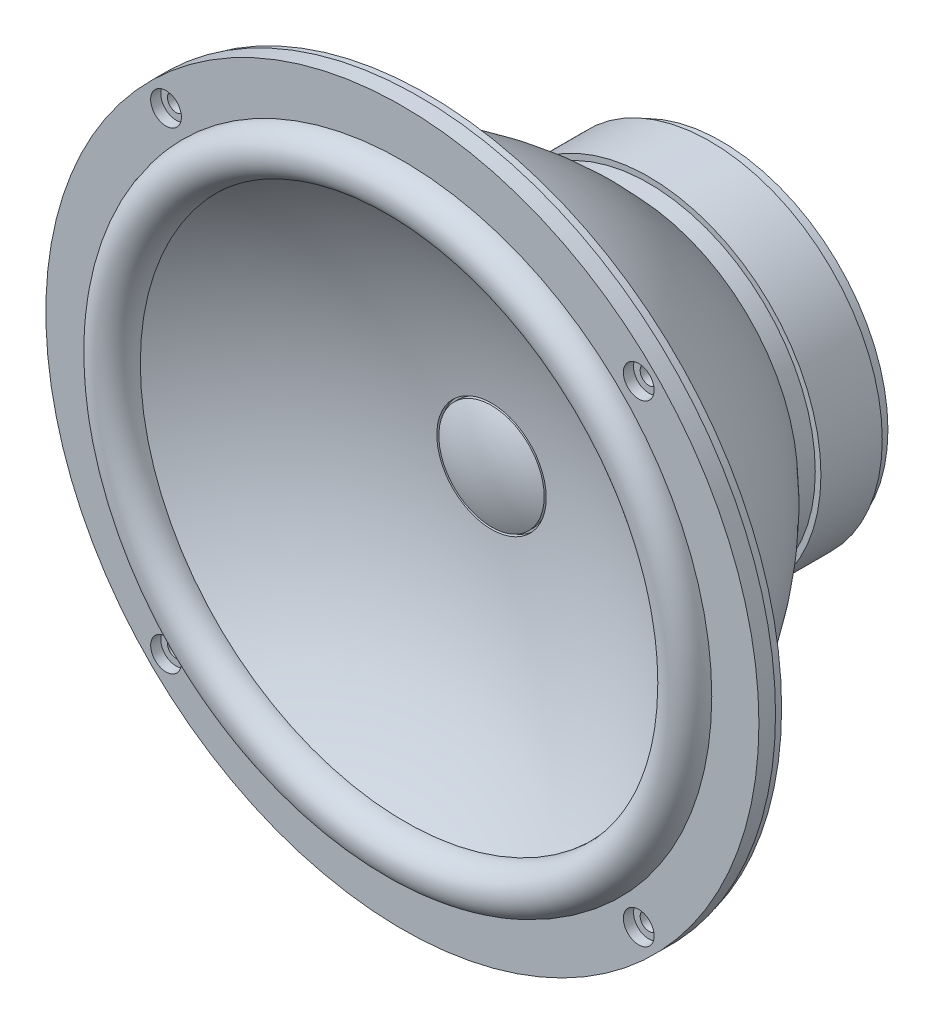
ISO-10303-21;
HEADER;
FILE_DESCRIPTION(('STEP AP214'),'2;1');
FILE_NAME('part.step','',(''),(''),'','','');
FILE_SCHEMA(('AUTOMOTIVE_DESIGN { 1 0 10303 214 1 1 1 1 }'));
ENDSEC;
DATA;
#1=APPLICATION_CONTEXT('core data for automotive mechanical design processes');
#2=APPLICATION_PROTOCOL_DEFINITION('international standard','automotive_design',2000,#1);
#3=PRODUCT_CONTEXT('',#1,'mechanical');
#4=PRODUCT('Part','Part','',(#3));
#5=PRODUCT_RELATED_PRODUCT_CATEGORY('part','',(#4));
#6=PRODUCT_DEFINITION_FORMATION('','',#4);
#7=PRODUCT_DEFINITION_CONTEXT('part definition',#1,'design');
#8=PRODUCT_DEFINITION('design','',#6,#7);
#9=PRODUCT_DEFINITION_SHAPE('','',#8);
#10=(LENGTH_UNIT() NAMED_UNIT(*) SI_UNIT(.MILLI.,.METRE.));
#11=(NAMED_UNIT(*) PLANE_ANGLE_UNIT() SI_UNIT($,.RADIAN.));
#12=(NAMED_UNIT(*) SI_UNIT($,.STERADIAN.) SOLID_ANGLE_UNIT());
#13=UNCERTAINTY_MEASURE_WITH_UNIT(LENGTH_MEASURE(1.E-05),#10,'distance_accuracy_value','');
#14=(GEOMETRIC_REPRESENTATION_CONTEXT(3) GLOBAL_UNCERTAINTY_ASSIGNED_CONTEXT((#13)) GLOBAL_UNIT_ASSIGNED_CONTEXT((#10,
#11,#12)) REPRESENTATION_CONTEXT('',''));
#15=CARTESIAN_POINT('',(0.,0.,0.));
#16=DIRECTION('',(0.,0.,1.));
#17=DIRECTION('',(1.,0.,0.));
#18=AXIS2_PLACEMENT_3D('',#15,#16,#17);
#19=CARTESIAN_POINT('',(-58.3363094478903,58.3363094478901,-85.8));
#20=DIRECTION('',(0.,0.,1.));
#21=DIRECTION('',(1.,0.,0.));
#22=AXIS2_PLACEMENT_3D('',#19,#20,#21);
#23=CYLINDRICAL_SURFACE('',#22,2.15);
#24=CARTESIAN_POINT('',(-58.3363094478903,58.3363094478901,-6.09999999999999));
#25=DIRECTION('',(0.,0.,-1.));
#26=DIRECTION('',(-1.,0.,0.));
#27=AXIS2_PLACEMENT_3D('',#24,#25,#26);
#28=CIRCLE('',#27,2.15);
#29=CARTESIAN_POINT('',(-60.4863094478903,58.3363094478901,-6.09999999999999));
#30=VERTEX_POINT('',#29);
#31=EDGE_CURVE('E71',#30,#30,#28,.T.);
#32=ORIENTED_EDGE('',*,*,#31,.T.);
#33=EDGE_LOOP('',(#32));
#34=FACE_BOUND('',#33,.T.);
#35=CARTESIAN_POINT('',(-58.3363094478903,58.3363094478901,-2.5019));
#36=DIRECTION('',(0.,0.,1.));
#37=DIRECTION('',(1.,0.,0.));
#38=AXIS2_PLACEMENT_3D('',#35,#36,#37);
#39=CIRCLE('',#38,2.15);
#40=CARTESIAN_POINT('',(-56.1863094478903,58.3363094478901,-2.5019));
#41=VERTEX_POINT('',#40);
#42=EDGE_CURVE('E47',#41,#41,#39,.F.);
#43=ORIENTED_EDGE('',*,*,#42,.F.);
#44=EDGE_LOOP('',(#43));
#45=FACE_BOUND('',#44,.T.);
#46=ADVANCED_FACE('F43',(#34,#45),#23,.F.);
#47=CARTESIAN_POINT('',(58.3363094478901,58.3363094478903,-85.8));
#48=DIRECTION('',(0.,0.,1.));
#49=DIRECTION('',(1.,0.,0.));
#50=AXIS2_PLACEMENT_3D('',#47,#48,#49);
#51=CYLINDRICAL_SURFACE('',#50,2.15);
#52=CARTESIAN_POINT('',(58.3363094478901,58.3363094478903,-6.10000000000001));
#53=DIRECTION('',(0.,0.,-1.));
#54=DIRECTION('',(-1.,0.,0.));
#55=AXIS2_PLACEMENT_3D('',#52,#53,#54);
#56=CIRCLE('',#55,2.15);
#57=CARTESIAN_POINT('',(56.1863094478901,58.3363094478903,-6.10000000000001));
#58=VERTEX_POINT('',#57);
#59=EDGE_CURVE('E75',#58,#58,#56,.T.);
#60=ORIENTED_EDGE('',*,*,#59,.T.);
#61=EDGE_LOOP('',(#60));
#62=FACE_BOUND('',#61,.T.);
#63=CARTESIAN_POINT('',(58.3363094478901,58.3363094478903,-2.5019));
#64=DIRECTION('',(0.,0.,1.));
#65=DIRECTION('',(1.,0.,0.));
#66=AXIS2_PLACEMENT_3D('',#63,#64,#65);
#67=CIRCLE('',#66,2.15);
#68=CARTESIAN_POINT('',(60.4863094478901,58.3363094478903,-2.5019));
#69=VERTEX_POINT('',#68);
#70=EDGE_CURVE('E66',#69,#69,#67,.F.);
#71=ORIENTED_EDGE('',*,*,#70,.F.);
#72=EDGE_LOOP('',(#71));
#73=FACE_BOUND('',#72,.T.);
#74=ADVANCED_FACE('F165',(#62,#73),#51,.F.);
#75=CARTESIAN_POINT('',(58.3363094478903,-58.3363094478901,-85.8));
#76=DIRECTION('',(0.,0.,1.));
#77=DIRECTION('',(1.,0.,0.));
#78=AXIS2_PLACEMENT_3D('',#75,#76,#77);
#79=CYLINDRICAL_SURFACE('',#78,2.15);
#80=CARTESIAN_POINT('',(58.3363094478903,-58.3363094478901,-6.10000000000001));
#81=DIRECTION('',(0.,0.,-1.));
#82=DIRECTION('',(-1.,0.,0.));
#83=AXIS2_PLACEMENT_3D('',#80,#81,#82);
#84=CIRCLE('',#83,2.15);
#85=CARTESIAN_POINT('',(56.1863094478903,-58.3363094478901,-6.10000000000001));
#86=VERTEX_POINT('',#85);
#87=EDGE_CURVE('E80',#86,#86,#84,.T.);
#88=ORIENTED_EDGE('',*,*,#87,.T.);
#89=EDGE_LOOP('',(#88));
#90=FACE_BOUND('',#89,.T.);
#91=CARTESIAN_POINT('',(58.3363094478903,-58.3363094478901,-2.5019));
#92=DIRECTION('',(0.,0.,1.));
#93=DIRECTION('',(1.,0.,0.));
#94=AXIS2_PLACEMENT_3D('',#91,#92,#93);
#95=CIRCLE('',#94,2.15);
#96=CARTESIAN_POINT('',(60.4863094478903,-58.3363094478901,-2.5019));
#97=VERTEX_POINT('',#96);
#98=EDGE_CURVE('E63',#97,#97,#95,.F.);
#99=ORIENTED_EDGE('',*,*,#98,.F.);
#100=EDGE_LOOP('',(#99));
#101=FACE_BOUND('',#100,.T.);
#102=ADVANCED_FACE('F171',(#90,#101),#79,.F.);
#103=CARTESIAN_POINT('',(-58.3363094478901,-58.3363094478903,-85.8));
#104=DIRECTION('',(0.,0.,1.));
#105=DIRECTION('',(1.,0.,0.));
#106=AXIS2_PLACEMENT_3D('',#103,#104,#105);
#107=CYLINDRICAL_SURFACE('',#106,2.15);
#108=CARTESIAN_POINT('',(-58.3363094478901,-58.3363094478903,-6.09999999999999));
#109=DIRECTION('',(0.,0.,-1.));
#110=DIRECTION('',(-1.,0.,0.));
#111=AXIS2_PLACEMENT_3D('',#108,#109,#110);
#112=CIRCLE('',#111,2.15);
#113=CARTESIAN_POINT('',(-60.4863094478901,-58.3363094478903,-6.09999999999999));
#114=VERTEX_POINT('',#113);
#115=EDGE_CURVE('E88',#114,#114,#112,.T.);
#116=ORIENTED_EDGE('',*,*,#115,.T.);
#117=EDGE_LOOP('',(#116));
#118=FACE_BOUND('',#117,.T.);
#119=CARTESIAN_POINT('',(-58.3363094478901,-58.3363094478903,-2.5019));
#120=DIRECTION('',(0.,0.,1.));
#121=DIRECTION('',(1.,0.,0.));
#122=AXIS2_PLACEMENT_3D('',#119,#120,#121);
#123=CIRCLE('',#122,2.15);
#124=CARTESIAN_POINT('',(-56.1863094478901,-58.3363094478903,-2.5019));
#125=VERTEX_POINT('',#124);
#126=EDGE_CURVE('E60',#125,#125,#123,.F.);
#127=ORIENTED_EDGE('',*,*,#126,.F.);
#128=EDGE_LOOP('',(#127));
#129=FACE_BOUND('',#128,.T.);
#130=ADVANCED_FACE('F177',(#118,#129),#107,.F.);
#131=CARTESIAN_POINT('',(0.,0.,-0.0269573961349388));
#132=DIRECTION('',(0.,0.,1.));
#133=DIRECTION('',(1.,0.,0.));
#134=AXIS2_PLACEMENT_3D('',#131,#132,#133);
#135=TOROIDAL_SURFACE('',#134,70.8331593014409,5.52695739613496);
#136=CARTESIAN_POINT('',(0.,0.,0.));
#137=DIRECTION('',(0.,0.,1.));
#138=DIRECTION('',(1.,0.,0.));
#139=AXIS2_PLACEMENT_3D('',#136,#137,#138);
#140=CIRCLE('',#139,76.3600509556607);
#141=CARTESIAN_POINT('',(76.3600509556607,0.,0.));
#142=VERTEX_POINT('',#141);
#143=EDGE_CURVE('E91',#142,#142,#140,.T.);
#144=ORIENTED_EDGE('',*,*,#143,.T.);
#145=EDGE_LOOP('',(#144));
#146=FACE_BOUND('',#145,.T.);
#147=CARTESIAN_POINT('',(0.,0.,-0.661359358512217));
#148=DIRECTION('',(0.,0.,1.));
#149=DIRECTION('',(1.,0.,0.));
#150=AXIS2_PLACEMENT_3D('',#147,#148,#149);
#151=CIRCLE('',#150,65.3427319766488);
#152=CARTESIAN_POINT('',(65.3427319766488,0.,-0.66135935851222));
#153=VERTEX_POINT('',#152);
#154=EDGE_CURVE('E10',#153,#153,#151,.T.);
#155=ORIENTED_EDGE('',*,*,#154,.F.);
#156=EDGE_LOOP('',(#155));
#157=FACE_BOUND('',#156,.T.);
#158=ADVANCED_FACE('F45',(#146,#157),#135,.T.);
#159=CARTESIAN_POINT('',(0.,0.,77.4350242939571));
#160=DIRECTION('',(0.,0.,1.));
#161=DIRECTION('',(1.,0.,0.));
#162=AXIS2_PLACEMENT_3D('',#159,#160,#161);
#163=DEGENERATE_TOROIDAL_SURFACE('',#162,2.88510745885022,100.,.T.);
#164=ORIENTED_EDGE('',*,*,#154,.T.);
#165=EDGE_LOOP('',(#164));
#166=FACE_BOUND('',#165,.T.);
#167=CARTESIAN_POINT('',(0.,0.,-22.));
#168=DIRECTION('',(0.,0.,1.));
#169=DIRECTION('',(1.,0.,0.));
#170=AXIS2_PLACEMENT_3D('',#167,#168,#169);
#171=CIRCLE('',#170,13.5);
#172=CARTESIAN_POINT('',(13.5,0.,-22.));
#173=VERTEX_POINT('',#172);
#174=EDGE_CURVE('E51',#173,#173,#171,.T.);
#175=ORIENTED_EDGE('',*,*,#174,.F.);
#176=EDGE_LOOP('',(#175));
#177=FACE_BOUND('',#176,.T.);
#178=ADVANCED_FACE('F155',(#166,#177),#163,.F.);
#179=CARTESIAN_POINT('',(0.,0.,-19.2403830344269));
#180=DIRECTION('',(0.,0.,1.));
#181=DIRECTION('',(1.,0.,0.));
#182=AXIS2_PLACEMENT_3D('',#179,#180,#181);
#183=CYLINDRICAL_SURFACE('',#182,13.5);
#184=ORIENTED_EDGE('',*,*,#174,.T.);
#185=EDGE_LOOP('',(#184));
#186=FACE_BOUND('',#185,.T.);
#187=CARTESIAN_POINT('',(0.,0.,-23.));
#188=DIRECTION('',(0.,0.,1.));
#189=DIRECTION('',(1.,0.,0.));
#190=AXIS2_PLACEMENT_3D('',#187,#188,#189);
#191=CIRCLE('',#190,13.5);
#192=CARTESIAN_POINT('',(13.5,0.,-23.));
#193=VERTEX_POINT('',#192);
#194=EDGE_CURVE('E56',#193,#193,#191,.T.);
#195=ORIENTED_EDGE('',*,*,#194,.F.);
#196=EDGE_LOOP('',(#195));
#197=FACE_BOUND('',#196,.T.);
#198=ADVANCED_FACE('F153',(#186,#197),#183,.F.);
#199=CARTESIAN_POINT('',(13.5,0.,-23.));
#200=DIRECTION('',(0.,0.,1.));
#201=DIRECTION('',(1.,0.,0.));
#202=AXIS2_PLACEMENT_3D('',#199,#200,#201);
#203=PLANE('',#202);
#204=ORIENTED_EDGE('',*,*,#194,.T.);
#205=EDGE_LOOP('',(#204));
#206=FACE_BOUND('',#205,.T.);
#207=CARTESIAN_POINT('',(0.,0.,-23.));
#208=DIRECTION('',(0.,0.,1.));
#209=DIRECTION('',(1.,0.,0.));
#210=AXIS2_PLACEMENT_3D('',#207,#208,#209);
#211=CIRCLE('',#210,13.);
#212=CARTESIAN_POINT('',(13.,0.,-23.));
#213=VERTEX_POINT('',#212);
#214=EDGE_CURVE('E145',#213,#213,#211,.T.);
#215=ORIENTED_EDGE('',*,*,#214,.F.);
#216=EDGE_LOOP('',(#215));
#217=FACE_BOUND('',#216,.T.);
#218=ADVANCED_FACE('F150',(#206,#217),#203,.T.);
#219=CARTESIAN_POINT('',(0.,0.,-19.2403830344269));
#220=DIRECTION('',(0.,0.,1.));
#221=DIRECTION('',(1.,0.,0.));
#222=AXIS2_PLACEMENT_3D('',#219,#220,#221);
#223=CYLINDRICAL_SURFACE('',#222,13.);
#224=ORIENTED_EDGE('',*,*,#214,.T.);
#225=EDGE_LOOP('',(#224));
#226=FACE_BOUND('',#225,.T.);
#227=CARTESIAN_POINT('',(0.,0.,-22.));
#228=DIRECTION('',(0.,0.,1.));
#229=DIRECTION('',(1.,0.,0.));
#230=AXIS2_PLACEMENT_3D('',#227,#228,#229);
#231=CIRCLE('',#230,13.);
#232=CARTESIAN_POINT('',(13.,0.,-22.));
#233=VERTEX_POINT('',#232);
#234=EDGE_CURVE('E142',#233,#233,#231,.T.);
#235=ORIENTED_EDGE('',*,*,#234,.F.);
#236=EDGE_LOOP('',(#235));
#237=FACE_BOUND('',#236,.T.);
#238=ADVANCED_FACE('F162',(#226,#237),#223,.T.);
#239=CARTESIAN_POINT('',(0.,0.,-51.2403830344269));
#240=DIRECTION('',(0.,0.,1.));
#241=DIRECTION('',(1.,0.,0.));
#242=AXIS2_PLACEMENT_3D('',#239,#240,#241);
#243=SPHERICAL_SURFACE('',#242,32.);
#244=ORIENTED_EDGE('',*,*,#234,.T.);
#245=EDGE_LOOP('',(#244));
#246=FACE_BOUND('',#245,.T.);
#247=ADVANCED_FACE('F246',(#246),#243,.T.);
#248=CARTESIAN_POINT('',(2.,0.,-85.8));
#249=DIRECTION('',(0.,0.,-1.));
#250=DIRECTION('',(-1.,0.,0.));
#251=AXIS2_PLACEMENT_3D('',#248,#249,#250);
#252=PLANE('',#251);
#253=CARTESIAN_POINT('',(0.,0.,-85.8));
#254=DIRECTION('',(0.,0.,1.));
#255=DIRECTION('',(1.,0.,0.));
#256=AXIS2_PLACEMENT_3D('',#253,#254,#255);
#257=CIRCLE('',#256,2.);
#258=CARTESIAN_POINT('',(2.,0.,-85.8));
#259=VERTEX_POINT('',#258);
#260=EDGE_CURVE('E139',#259,#259,#257,.T.);
#261=ORIENTED_EDGE('',*,*,#260,.F.);
#262=EDGE_LOOP('',(#261));
#263=FACE_BOUND('',#262,.T.);
#264=ADVANCED_FACE('F242',(#263),#252,.T.);
#265=CARTESIAN_POINT('',(0.,0.,-19.2403830344269));
#266=DIRECTION('',(0.,0.,1.));
#267=DIRECTION('',(1.,0.,0.));
#268=AXIS2_PLACEMENT_3D('',#265,#266,#267);
#269=CYLINDRICAL_SURFACE('',#268,2.);
#270=ORIENTED_EDGE('',*,*,#260,.T.);
#271=EDGE_LOOP('',(#270));
#272=FACE_BOUND('',#271,.T.);
#273=CARTESIAN_POINT('',(0.,0.,-83.8));
#274=DIRECTION('',(0.,0.,1.));
#275=DIRECTION('',(1.,0.,0.));
#276=AXIS2_PLACEMENT_3D('',#273,#274,#275);
#277=CIRCLE('',#276,2.);
#278=CARTESIAN_POINT('',(2.,0.,-83.8));
#279=VERTEX_POINT('',#278);
#280=EDGE_CURVE('E136',#279,#279,#277,.T.);
#281=ORIENTED_EDGE('',*,*,#280,.F.);
#282=EDGE_LOOP('',(#281));
#283=FACE_BOUND('',#282,.T.);
#284=ADVANCED_FACE('F238',(#272,#283),#269,.T.);
#285=CARTESIAN_POINT('',(5.,0.,-83.8));
#286=DIRECTION('',(0.,0.,-1.));
#287=DIRECTION('',(-1.,0.,0.));
#288=AXIS2_PLACEMENT_3D('',#285,#286,#287);
#289=PLANE('',#288);
#290=ORIENTED_EDGE('',*,*,#280,.T.);
#291=EDGE_LOOP('',(#290));
#292=FACE_BOUND('',#291,.T.);
#293=CARTESIAN_POINT('',(0.,0.,-83.8));
#294=DIRECTION('',(0.,0.,1.));
#295=DIRECTION('',(1.,0.,0.));
#296=AXIS2_PLACEMENT_3D('',#293,#294,#295);
#297=CIRCLE('',#296,5.);
#298=CARTESIAN_POINT('',(5.,0.,-83.8));
#299=VERTEX_POINT('',#298);
#300=EDGE_CURVE('E133',#299,#299,#297,.T.);
#301=ORIENTED_EDGE('',*,*,#300,.F.);
#302=EDGE_LOOP('',(#301));
#303=FACE_BOUND('',#302,.T.);
#304=ADVANCED_FACE('F234',(#292,#303),#289,.T.);
#305=CARTESIAN_POINT('',(0.,0.,-19.2403830344269));
#306=DIRECTION('',(0.,0.,1.));
#307=DIRECTION('',(1.,0.,0.));
#308=AXIS2_PLACEMENT_3D('',#305,#306,#307);
#309=CYLINDRICAL_SURFACE('',#308,5.);
#310=ORIENTED_EDGE('',*,*,#300,.T.);
#311=EDGE_LOOP('',(#310));
#312=FACE_BOUND('',#311,.T.);
#313=CARTESIAN_POINT('',(0.,0.,-82.8));
#314=DIRECTION('',(0.,0.,1.));
#315=DIRECTION('',(1.,0.,0.));
#316=AXIS2_PLACEMENT_3D('',#313,#314,#315);
#317=CIRCLE('',#316,5.);
#318=CARTESIAN_POINT('',(5.,0.,-82.8));
#319=VERTEX_POINT('',#318);
#320=EDGE_CURVE('E130',#319,#319,#317,.T.);
#321=ORIENTED_EDGE('',*,*,#320,.F.);
#322=EDGE_LOOP('',(#321));
#323=FACE_BOUND('',#322,.T.);
#324=ADVANCED_FACE('F230',(#312,#323),#309,.T.);
#325=CARTESIAN_POINT('',(17.526,0.,-82.8));
#326=DIRECTION('',(0.,0.,-1.));
#327=DIRECTION('',(-1.,0.,0.));
#328=AXIS2_PLACEMENT_3D('',#325,#326,#327);
#329=PLANE('',#328);
#330=ORIENTED_EDGE('',*,*,#320,.T.);
#331=EDGE_LOOP('',(#330));
#332=FACE_BOUND('',#331,.T.);
#333=CARTESIAN_POINT('',(0.,0.,-82.8));
#334=DIRECTION('',(0.,0.,1.));
#335=DIRECTION('',(1.,0.,0.));
#336=AXIS2_PLACEMENT_3D('',#333,#334,#335);
#337=CIRCLE('',#336,17.526);
#338=CARTESIAN_POINT('',(17.526,0.,-82.8));
#339=VERTEX_POINT('',#338);
#340=EDGE_CURVE('E127',#339,#339,#337,.T.);
#341=ORIENTED_EDGE('',*,*,#340,.F.);
#342=EDGE_LOOP('',(#341));
#343=FACE_BOUND('',#342,.T.);
#344=ADVANCED_FACE('F226',(#332,#343),#329,.T.);
#345=CARTESIAN_POINT('',(0.,0.,-12.3542285823034));
#346=DIRECTION('',(0.,0.,1.));
#347=DIRECTION('',(1.,0.,0.));
#348=AXIS2_PLACEMENT_3D('',#345,#346,#347);
#349=DEGENERATE_TOROIDAL_SURFACE('',#348,17.526,70.4457714176966,.T.);
#350=ORIENTED_EDGE('',*,*,#340,.T.);
#351=EDGE_LOOP('',(#350));
#352=FACE_BOUND('',#351,.T.);
#353=CARTESIAN_POINT('',(0.,0.,-78.736));
#354=DIRECTION('',(0.,0.,1.));
#355=DIRECTION('',(1.,0.,0.));
#356=AXIS2_PLACEMENT_3D('',#353,#354,#355);
#357=CIRCLE('',#356,41.1070757617849);
#358=CARTESIAN_POINT('',(41.1070757617849,0.,-78.736));
#359=VERTEX_POINT('',#358);
#360=EDGE_CURVE('E124',#359,#359,#357,.T.);
#361=ORIENTED_EDGE('',*,*,#360,.F.);
#362=EDGE_LOOP('',(#361));
#363=FACE_BOUND('',#362,.T.);
#364=ADVANCED_FACE('F222',(#352,#363),#349,.T.);
#365=CARTESIAN_POINT('',(0.,0.,-19.2403830344269));
#366=DIRECTION('',(0.,0.,1.));
#367=DIRECTION('',(1.,0.,0.));
#368=AXIS2_PLACEMENT_3D('',#365,#366,#367);
#369=CYLINDRICAL_SURFACE('',#368,41.1070757617849);
#370=ORIENTED_EDGE('',*,*,#360,.T.);
#371=EDGE_LOOP('',(#370));
#372=FACE_BOUND('',#371,.T.);
#373=CARTESIAN_POINT('',(0.,0.,-75.942));
#374=DIRECTION('',(0.,0.,1.));
#375=DIRECTION('',(1.,0.,0.));
#376=AXIS2_PLACEMENT_3D('',#373,#374,#375);
#377=CIRCLE('',#376,41.1070757617849);
#378=CARTESIAN_POINT('',(41.1070757617849,0.,-75.942));
#379=VERTEX_POINT('',#378);
#380=EDGE_CURVE('E121',#379,#379,#377,.T.);
#381=ORIENTED_EDGE('',*,*,#380,.F.);
#382=EDGE_LOOP('',(#381));
#383=FACE_BOUND('',#382,.T.);
#384=ADVANCED_FACE('F218',(#372,#383),#369,.T.);
#385=CARTESIAN_POINT('',(42.5,0.,-75.942));
#386=DIRECTION('',(0.,0.,-1.));
#387=DIRECTION('',(-1.,0.,0.));
#388=AXIS2_PLACEMENT_3D('',#385,#386,#387);
#389=PLANE('',#388);
#390=ORIENTED_EDGE('',*,*,#380,.T.);
#391=EDGE_LOOP('',(#390));
#392=FACE_BOUND('',#391,.T.);
#393=CARTESIAN_POINT('',(0.,0.,-75.942));
#394=DIRECTION('',(0.,0.,1.));
#395=DIRECTION('',(1.,0.,0.));
#396=AXIS2_PLACEMENT_3D('',#393,#394,#395);
#397=CIRCLE('',#396,42.5);
#398=CARTESIAN_POINT('',(42.5,0.,-75.942));
#399=VERTEX_POINT('',#398);
#400=EDGE_CURVE('E118',#399,#399,#397,.T.);
#401=ORIENTED_EDGE('',*,*,#400,.F.);
#402=EDGE_LOOP('',(#401));
#403=FACE_BOUND('',#402,.T.);
#404=ADVANCED_FACE('F214',(#392,#403),#389,.T.);
#405=CARTESIAN_POINT('',(0.,0.,-19.2403830344269));
#406=DIRECTION('',(0.,0.,1.));
#407=DIRECTION('',(1.,0.,0.));
#408=AXIS2_PLACEMENT_3D('',#405,#406,#407);
#409=CYLINDRICAL_SURFACE('',#408,42.5);
#410=ORIENTED_EDGE('',*,*,#400,.T.);
#411=EDGE_LOOP('',(#410));
#412=FACE_BOUND('',#411,.T.);
#413=CARTESIAN_POINT('',(0.,0.,-60.8036));
#414=DIRECTION('',(0.,0.,1.));
#415=DIRECTION('',(1.,0.,0.));
#416=AXIS2_PLACEMENT_3D('',#413,#414,#415);
#417=CIRCLE('',#416,42.5);
#418=CARTESIAN_POINT('',(42.5,0.,-60.8036));
#419=VERTEX_POINT('',#418);
#420=EDGE_CURVE('E115',#419,#419,#417,.T.);
#421=ORIENTED_EDGE('',*,*,#420,.F.);
#422=EDGE_LOOP('',(#421));
#423=FACE_BOUND('',#422,.T.);
#424=ADVANCED_FACE('F210',(#412,#423),#409,.T.);
#425=CARTESIAN_POINT('',(41.1070757617849,0.,-60.8036));
#426=DIRECTION('',(0.,0.,1.));
#427=DIRECTION('',(1.,0.,0.));
#428=AXIS2_PLACEMENT_3D('',#425,#426,#427);
#429=PLANE('',#428);
#430=ORIENTED_EDGE('',*,*,#420,.T.);
#431=EDGE_LOOP('',(#430));
#432=FACE_BOUND('',#431,.T.);
#433=CARTESIAN_POINT('',(0.,0.,-60.8036));
#434=DIRECTION('',(0.,0.,1.));
#435=DIRECTION('',(1.,0.,0.));
#436=AXIS2_PLACEMENT_3D('',#433,#434,#435);
#437=CIRCLE('',#436,41.1070757617849);
#438=CARTESIAN_POINT('',(41.1070757617849,0.,-60.8036));
#439=VERTEX_POINT('',#438);
#440=EDGE_CURVE('E112',#439,#439,#437,.T.);
#441=ORIENTED_EDGE('',*,*,#440,.F.);
#442=EDGE_LOOP('',(#441));
#443=FACE_BOUND('',#442,.T.);
#444=ADVANCED_FACE('F206',(#432,#443),#429,.T.);
#445=CARTESIAN_POINT('',(0.,0.,-19.2403830344269));
#446=DIRECTION('',(0.,0.,1.));
#447=DIRECTION('',(1.,0.,0.));
#448=AXIS2_PLACEMENT_3D('',#445,#446,#447);
#449=CYLINDRICAL_SURFACE('',#448,41.1070757617849);
#450=ORIENTED_EDGE('',*,*,#440,.T.);
#451=EDGE_LOOP('',(#450));
#452=FACE_BOUND('',#451,.T.);
#453=CARTESIAN_POINT('',(0.,0.,-56.4856));
#454=DIRECTION('',(0.,0.,1.));
#455=DIRECTION('',(1.,0.,0.));
#456=AXIS2_PLACEMENT_3D('',#453,#454,#455);
#457=CIRCLE('',#456,41.1070757617849);
#458=CARTESIAN_POINT('',(41.1070757617849,0.,-56.4856));
#459=VERTEX_POINT('',#458);
#460=EDGE_CURVE('E109',#459,#459,#457,.T.);
#461=ORIENTED_EDGE('',*,*,#460,.F.);
#462=EDGE_LOOP('',(#461));
#463=FACE_BOUND('',#462,.T.);
#464=ADVANCED_FACE('F202',(#452,#463),#449,.T.);
#465=CARTESIAN_POINT('',(0.,0.,19.8051544675251));
#466=DIRECTION('',(0.,0.,1.));
#467=DIRECTION('',(1.,0.,0.));
#468=AXIS2_PLACEMENT_3D('',#465,#466,#467);
#469=DEGENERATE_TOROIDAL_SURFACE('',#468,25.9919613607834,101.6,.F.);
#470=ORIENTED_EDGE('',*,*,#460,.T.);
#471=EDGE_LOOP('',(#470));
#472=FACE_BOUND('',#471,.T.);
#473=CARTESIAN_POINT('',(0.,0.,-6.1));
#474=DIRECTION('',(0.,0.,1.));
#475=DIRECTION('',(1.,0.,0.));
#476=AXIS2_PLACEMENT_3D('',#473,#474,#475);
#477=CIRCLE('',#476,72.25);
#478=CARTESIAN_POINT('',(72.25,0.,-6.10000000000001));
#479=VERTEX_POINT('',#478);
#480=EDGE_CURVE('E106',#479,#479,#477,.T.);
#481=ORIENTED_EDGE('',*,*,#480,.F.);
#482=EDGE_LOOP('',(#481));
#483=FACE_BOUND('',#482,.T.);
#484=ADVANCED_FACE('F198',(#472,#483),#469,.F.);
#485=CARTESIAN_POINT('',(87.5,0.,-6.1));
#486=DIRECTION('',(0.,0.,-1.));
#487=DIRECTION('',(-1.,0.,0.));
#488=AXIS2_PLACEMENT_3D('',#485,#486,#487);
#489=PLANE('',#488);
#490=ORIENTED_EDGE('',*,*,#115,.F.);
#491=EDGE_LOOP('',(#490));
#492=FACE_BOUND('',#491,.T.);
#493=ORIENTED_EDGE('',*,*,#87,.F.);
#494=EDGE_LOOP('',(#493));
#495=FACE_BOUND('',#494,.T.);
#496=ORIENTED_EDGE('',*,*,#59,.F.);
#497=EDGE_LOOP('',(#496));
#498=FACE_BOUND('',#497,.T.);
#499=ORIENTED_EDGE('',*,*,#31,.F.);
#500=EDGE_LOOP('',(#499));
#501=FACE_BOUND('',#500,.T.);
#502=ORIENTED_EDGE('',*,*,#480,.T.);
#503=EDGE_LOOP('',(#502));
#504=FACE_BOUND('',#503,.T.);
#505=CARTESIAN_POINT('',(0.,0.,-6.09999999999999));
#506=DIRECTION('',(0.,0.,1.));
#507=DIRECTION('',(1.,0.,0.));
#508=AXIS2_PLACEMENT_3D('',#505,#506,#507);
#509=CIRCLE('',#508,87.5);
#510=CARTESIAN_POINT('',(87.5,0.,-6.1));
#511=VERTEX_POINT('',#510);
#512=EDGE_CURVE('E103',#511,#511,#509,.T.);
#513=ORIENTED_EDGE('',*,*,#512,.F.);
#514=EDGE_LOOP('',(#513));
#515=FACE_BOUND('',#514,.T.);
#516=ADVANCED_FACE('F195',(#492,#495,#498,#501,#504,#515),#489,.T.);
#517=CARTESIAN_POINT('',(0.,0.,-19.2403830344269));
#518=DIRECTION('',(0.,0.,1.));
#519=DIRECTION('',(1.,0.,0.));
#520=AXIS2_PLACEMENT_3D('',#517,#518,#519);
#521=CYLINDRICAL_SURFACE('',#520,87.5);
#522=ORIENTED_EDGE('',*,*,#512,.T.);
#523=EDGE_LOOP('',(#522));
#524=FACE_BOUND('',#523,.T.);
#525=CARTESIAN_POINT('',(0.,0.,-4.09999999999999));
#526=DIRECTION('',(0.,0.,1.));
#527=DIRECTION('',(1.,0.,0.));
#528=AXIS2_PLACEMENT_3D('',#525,#526,#527);
#529=CIRCLE('',#528,87.5);
#530=CARTESIAN_POINT('',(87.5,0.,-4.1));
#531=VERTEX_POINT('',#530);
#532=EDGE_CURVE('E100',#531,#531,#529,.T.);
#533=ORIENTED_EDGE('',*,*,#532,.F.);
#534=EDGE_LOOP('',(#533));
#535=FACE_BOUND('',#534,.T.);
#536=ADVANCED_FACE('F191',(#524,#535),#521,.T.);
#537=CARTESIAN_POINT('',(88.,0.,-4.1));
#538=DIRECTION('',(0.,0.,-1.));
#539=DIRECTION('',(-1.,0.,0.));
#540=AXIS2_PLACEMENT_3D('',#537,#538,#539);
#541=PLANE('',#540);
#542=ORIENTED_EDGE('',*,*,#532,.T.);
#543=EDGE_LOOP('',(#542));
#544=FACE_BOUND('',#543,.T.);
#545=CARTESIAN_POINT('',(0.,0.,-4.09999999999999));
#546=DIRECTION('',(0.,0.,1.));
#547=DIRECTION('',(1.,0.,0.));
#548=AXIS2_PLACEMENT_3D('',#545,#546,#547);
#549=CIRCLE('',#548,88.);
#550=CARTESIAN_POINT('',(88.,0.,-4.1));
#551=VERTEX_POINT('',#550);
#552=EDGE_CURVE('E97',#551,#551,#549,.T.);
#553=ORIENTED_EDGE('',*,*,#552,.F.);
#554=EDGE_LOOP('',(#553));
#555=FACE_BOUND('',#554,.T.);
#556=ADVANCED_FACE('F187',(#544,#555),#541,.T.);
#557=CARTESIAN_POINT('',(0.,0.,-19.2403830344269));
#558=DIRECTION('',(0.,0.,1.));
#559=DIRECTION('',(1.,0.,0.));
#560=AXIS2_PLACEMENT_3D('',#557,#558,#559);
#561=CYLINDRICAL_SURFACE('',#560,88.);
#562=ORIENTED_EDGE('',*,*,#552,.T.);
#563=EDGE_LOOP('',(#562));
#564=FACE_BOUND('',#563,.T.);
#565=CARTESIAN_POINT('',(0.,0.,0.));
#566=DIRECTION('',(0.,0.,1.));
#567=DIRECTION('',(1.,0.,0.));
#568=AXIS2_PLACEMENT_3D('',#565,#566,#567);
#569=CIRCLE('',#568,88.);
#570=CARTESIAN_POINT('',(88.,0.,0.));
#571=VERTEX_POINT('',#570);
#572=EDGE_CURVE('E94',#571,#571,#569,.T.);
#573=ORIENTED_EDGE('',*,*,#572,.F.);
#574=EDGE_LOOP('',(#573));
#575=FACE_BOUND('',#574,.T.);
#576=ADVANCED_FACE('F183',(#564,#575),#561,.T.);
#577=CARTESIAN_POINT('',(76.3600509556607,0.,0.));
#578=DIRECTION('',(0.,0.,1.));
#579=DIRECTION('',(1.,0.,0.));
#580=AXIS2_PLACEMENT_3D('',#577,#578,#579);
#581=PLANE('',#580);
#582=CARTESIAN_POINT('',(-58.3363094478901,-58.3363094478903,0.));
#583=DIRECTION('',(0.,0.,1.));
#584=DIRECTION('',(1.,0.,0.));
#585=AXIS2_PLACEMENT_3D('',#582,#583,#584);
#586=CIRCLE('',#585,3.7973);
#587=CARTESIAN_POINT('',(-54.5390094478901,-58.3363094478903,0.));
#588=VERTEX_POINT('',#587);
#589=EDGE_CURVE('E491',#588,#588,#586,.T.);
#590=ORIENTED_EDGE('',*,*,#589,.F.);
#591=EDGE_LOOP('',(#590));
#592=FACE_BOUND('',#591,.T.);
#593=CARTESIAN_POINT('',(58.3363094478903,-58.3363094478901,0.));
#594=DIRECTION('',(0.,0.,1.));
#595=DIRECTION('',(1.,0.,0.));
#596=AXIS2_PLACEMENT_3D('',#593,#594,#595);
#597=CIRCLE('',#596,3.7973);
#598=CARTESIAN_POINT('',(62.1336094478903,-58.3363094478901,0.));
#599=VERTEX_POINT('',#598);
#600=EDGE_CURVE('E485',#599,#599,#597,.T.);
#601=ORIENTED_EDGE('',*,*,#600,.F.);
#602=EDGE_LOOP('',(#601));
#603=FACE_BOUND('',#602,.T.);
#604=CARTESIAN_POINT('',(58.3363094478901,58.3363094478903,0.));
#605=DIRECTION('',(0.,0.,1.));
#606=DIRECTION('',(1.,0.,0.));
#607=AXIS2_PLACEMENT_3D('',#604,#605,#606);
#608=CIRCLE('',#607,3.7973);
#609=CARTESIAN_POINT('',(62.1336094478901,58.3363094478903,0.));
#610=VERTEX_POINT('',#609);
#611=EDGE_CURVE('E476',#610,#610,#608,.T.);
#612=ORIENTED_EDGE('',*,*,#611,.F.);
#613=EDGE_LOOP('',(#612));
#614=FACE_BOUND('',#613,.T.);
#615=CARTESIAN_POINT('',(-58.3363094478903,58.3363094478901,0.));
#616=DIRECTION('',(0.,0.,1.));
#617=DIRECTION('',(1.,0.,0.));
#618=AXIS2_PLACEMENT_3D('',#615,#616,#617);
#619=CIRCLE('',#618,3.7973);
#620=CARTESIAN_POINT('',(-54.5390094478903,58.3363094478901,0.));
#621=VERTEX_POINT('',#620);
#622=EDGE_CURVE('E83',#621,#621,#619,.T.);
#623=ORIENTED_EDGE('',*,*,#622,.F.);
#624=EDGE_LOOP('',(#623));
#625=FACE_BOUND('',#624,.T.);
#626=ORIENTED_EDGE('',*,*,#572,.T.);
#627=EDGE_LOOP('',(#626));
#628=FACE_BOUND('',#627,.T.);
#629=ORIENTED_EDGE('',*,*,#143,.F.);
#630=EDGE_LOOP('',(#629));
#631=FACE_BOUND('',#630,.T.);
#632=ADVANCED_FACE('F179',(#592,#603,#614,#625,#628,#631),#581,.T.);
#633=CARTESIAN_POINT('',(-58.3363094478901,-58.3363094478903,-2.5019));
#634=DIRECTION('',(0.,0.,1.));
#635=DIRECTION('',(1.,0.,0.));
#636=AXIS2_PLACEMENT_3D('',#633,#634,#635);
#637=PLANE('',#636);
#638=CARTESIAN_POINT('',(-58.3363094478901,-58.3363094478903,-2.5019));
#639=DIRECTION('',(0.,0.,1.));
#640=DIRECTION('',(1.,0.,0.));
#641=AXIS2_PLACEMENT_3D('',#638,#639,#640);
#642=CIRCLE('',#641,3.7973);
#643=CARTESIAN_POINT('',(-54.5390094478901,-58.3363094478903,-2.5019));
#644=VERTEX_POINT('',#643);
#645=EDGE_CURVE('E488',#644,#644,#642,.T.);
#646=ORIENTED_EDGE('',*,*,#645,.T.);
#647=EDGE_LOOP('',(#646));
#648=FACE_BOUND('',#647,.T.);
#649=ORIENTED_EDGE('',*,*,#126,.T.);
#650=EDGE_LOOP('',(#649));
#651=FACE_BOUND('',#650,.T.);
#652=ADVANCED_FACE('F182',(#648,#651),#637,.T.);
#653=CARTESIAN_POINT('',(-58.3363094478901,-58.3363094478903,-2.5019));
#654=DIRECTION('',(0.,0.,1.));
#655=DIRECTION('',(1.,0.,0.));
#656=AXIS2_PLACEMENT_3D('',#653,#654,#655);
#657=CYLINDRICAL_SURFACE('',#656,3.7973);
#658=ORIENTED_EDGE('',*,*,#645,.F.);
#659=EDGE_LOOP('',(#658));
#660=FACE_BOUND('',#659,.T.);
#661=ORIENTED_EDGE('',*,*,#589,.T.);
#662=EDGE_LOOP('',(#661));
#663=FACE_BOUND('',#662,.T.);
#664=ADVANCED_FACE('F393',(#660,#663),#657,.F.);
#665=CARTESIAN_POINT('',(58.3363094478903,-58.3363094478901,-2.5019));
#666=DIRECTION('',(0.,0.,1.));
#667=DIRECTION('',(1.,0.,0.));
#668=AXIS2_PLACEMENT_3D('',#665,#666,#667);
#669=PLANE('',#668);
#670=CARTESIAN_POINT('',(58.3363094478903,-58.3363094478901,-2.5019));
#671=DIRECTION('',(0.,0.,1.));
#672=DIRECTION('',(1.,0.,0.));
#673=AXIS2_PLACEMENT_3D('',#670,#671,#672);
#674=CIRCLE('',#673,3.7973);
#675=CARTESIAN_POINT('',(62.1336094478903,-58.3363094478901,-2.5019));
#676=VERTEX_POINT('',#675);
#677=EDGE_CURVE('E480',#676,#676,#674,.T.);
#678=ORIENTED_EDGE('',*,*,#677,.T.);
#679=EDGE_LOOP('',(#678));
#680=FACE_BOUND('',#679,.T.);
#681=ORIENTED_EDGE('',*,*,#98,.T.);
#682=EDGE_LOOP('',(#681));
#683=FACE_BOUND('',#682,.T.);
#684=ADVANCED_FACE('F402',(#680,#683),#669,.T.);
#685=CARTESIAN_POINT('',(58.3363094478903,-58.3363094478901,-2.5019));
#686=DIRECTION('',(0.,0.,1.));
#687=DIRECTION('',(1.,0.,0.));
#688=AXIS2_PLACEMENT_3D('',#685,#686,#687);
#689=CYLINDRICAL_SURFACE('',#688,3.7973);
#690=ORIENTED_EDGE('',*,*,#677,.F.);
#691=EDGE_LOOP('',(#690));
#692=FACE_BOUND('',#691,.T.);
#693=ORIENTED_EDGE('',*,*,#600,.T.);
#694=EDGE_LOOP('',(#693));
#695=FACE_BOUND('',#694,.T.);
#696=ADVANCED_FACE('F411',(#692,#695),#689,.F.);
#697=CARTESIAN_POINT('',(58.3363094478901,58.3363094478903,-2.5019));
#698=DIRECTION('',(0.,0.,1.));
#699=DIRECTION('',(1.,0.,0.));
#700=AXIS2_PLACEMENT_3D('',#697,#698,#699);
#701=PLANE('',#700);
#702=CARTESIAN_POINT('',(58.3363094478901,58.3363094478903,-2.5019));
#703=DIRECTION('',(0.,0.,1.));
#704=DIRECTION('',(1.,0.,0.));
#705=AXIS2_PLACEMENT_3D('',#702,#703,#704);
#706=CIRCLE('',#705,3.7973);
#707=CARTESIAN_POINT('',(62.1336094478901,58.3363094478903,-2.5019));
#708=VERTEX_POINT('',#707);
#709=EDGE_CURVE('E474',#708,#708,#706,.T.);
#710=ORIENTED_EDGE('',*,*,#709,.T.);
#711=EDGE_LOOP('',(#710));
#712=FACE_BOUND('',#711,.T.);
#713=ORIENTED_EDGE('',*,*,#70,.T.);
#714=EDGE_LOOP('',(#713));
#715=FACE_BOUND('',#714,.T.);
#716=ADVANCED_FACE('F420',(#712,#715),#701,.T.);
#717=CARTESIAN_POINT('',(58.3363094478901,58.3363094478903,-2.5019));
#718=DIRECTION('',(0.,0.,1.));
#719=DIRECTION('',(1.,0.,0.));
#720=AXIS2_PLACEMENT_3D('',#717,#718,#719);
#721=CYLINDRICAL_SURFACE('',#720,3.7973);
#722=ORIENTED_EDGE('',*,*,#709,.F.);
#723=EDGE_LOOP('',(#722));
#724=FACE_BOUND('',#723,.T.);
#725=ORIENTED_EDGE('',*,*,#611,.T.);
#726=EDGE_LOOP('',(#725));
#727=FACE_BOUND('',#726,.T.);
#728=ADVANCED_FACE('F429',(#724,#727),#721,.F.);
#729=CARTESIAN_POINT('',(-58.3363094478903,58.3363094478901,-2.5019));
#730=DIRECTION('',(0.,0.,1.));
#731=DIRECTION('',(1.,0.,0.));
#732=AXIS2_PLACEMENT_3D('',#729,#730,#731);
#733=PLANE('',#732);
#734=CARTESIAN_POINT('',(-58.3363094478903,58.3363094478901,-2.5019));
#735=DIRECTION('',(0.,0.,1.));
#736=DIRECTION('',(1.,0.,0.));
#737=AXIS2_PLACEMENT_3D('',#734,#735,#736);
#738=CIRCLE('',#737,3.7973);
#739=CARTESIAN_POINT('',(-54.5390094478903,58.3363094478901,-2.5019));
#740=VERTEX_POINT('',#739);
#741=EDGE_CURVE('E64',#740,#740,#738,.T.);
#742=ORIENTED_EDGE('',*,*,#741,.T.);
#743=EDGE_LOOP('',(#742));
#744=FACE_BOUND('',#743,.T.);
#745=ORIENTED_EDGE('',*,*,#42,.T.);
#746=EDGE_LOOP('',(#745));
#747=FACE_BOUND('',#746,.T.);
#748=ADVANCED_FACE('F438',(#744,#747),#733,.T.);
#749=CARTESIAN_POINT('',(-58.3363094478903,58.3363094478901,-2.5019));
#750=DIRECTION('',(0.,0.,1.));
#751=DIRECTION('',(1.,0.,0.));
#752=AXIS2_PLACEMENT_3D('',#749,#750,#751);
#753=CYLINDRICAL_SURFACE('',#752,3.7973);
#754=ORIENTED_EDGE('',*,*,#741,.F.);
#755=EDGE_LOOP('',(#754));
#756=FACE_BOUND('',#755,.T.);
#757=ORIENTED_EDGE('',*,*,#622,.T.);
#758=EDGE_LOOP('',(#757));
#759=FACE_BOUND('',#758,.T.);
#760=ADVANCED_FACE('F447',(#756,#759),#753,.F.);
#761=CLOSED_SHELL('',(#46,#74,#102,#130,#158,#178,#198,#218,#238,#247,#264,#284,#304,#324,#344,
#364,#384,#404,#424,#444,#464,#484,#516,#536,#556,#576,#632,#652,#664,#684,#696,#716,#728,#748,#760));
#762=MANIFOLD_SOLID_BREP('B2',#761);
#763=ADVANCED_BREP_SHAPE_REPRESENTATION('',(#18,#762),#14);
#764=SHAPE_DEFINITION_REPRESENTATION(#9,#763);
ENDSEC;
END-ISO-10303-21;
